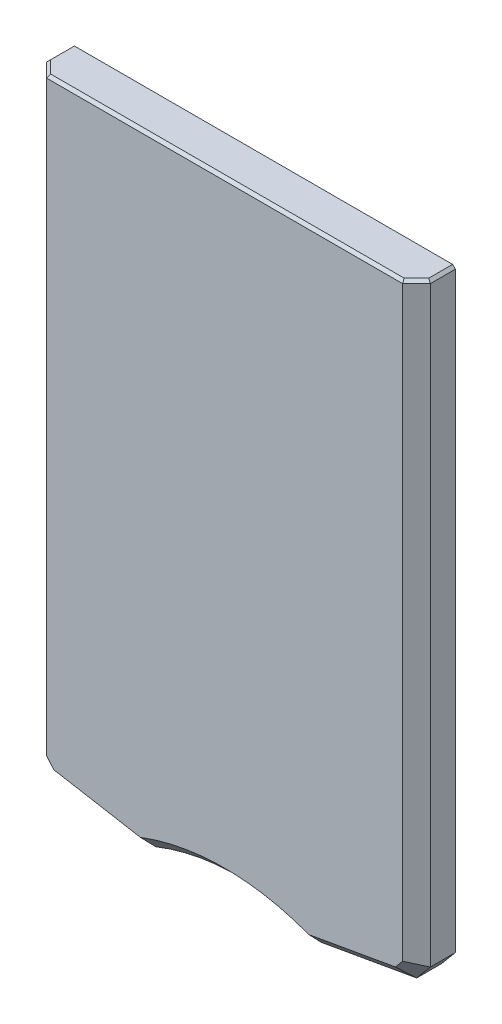
ISO-10303-21;
HEADER;
FILE_DESCRIPTION(('STEP AP214'),'2;1');
FILE_NAME('part.step','',(''),(''),'','','');
FILE_SCHEMA(('AUTOMOTIVE_DESIGN { 1 0 10303 214 1 1 1 1 }'));
ENDSEC;
DATA;
#1=APPLICATION_CONTEXT('core data for automotive mechanical design processes');
#2=APPLICATION_PROTOCOL_DEFINITION('international standard','automotive_design',2000,#1);
#3=PRODUCT_CONTEXT('',#1,'mechanical');
#4=PRODUCT('Part','Part','',(#3));
#5=PRODUCT_RELATED_PRODUCT_CATEGORY('part','',(#4));
#6=PRODUCT_DEFINITION_FORMATION('','',#4);
#7=PRODUCT_DEFINITION_CONTEXT('part definition',#1,'design');
#8=PRODUCT_DEFINITION('design','',#6,#7);
#9=PRODUCT_DEFINITION_SHAPE('','',#8);
#10=(LENGTH_UNIT() NAMED_UNIT(*) SI_UNIT(.MILLI.,.METRE.));
#11=(NAMED_UNIT(*) PLANE_ANGLE_UNIT() SI_UNIT($,.RADIAN.));
#12=(NAMED_UNIT(*) SI_UNIT($,.STERADIAN.) SOLID_ANGLE_UNIT());
#13=UNCERTAINTY_MEASURE_WITH_UNIT(LENGTH_MEASURE(1.E-05),#10,'distance_accuracy_value','');
#14=(GEOMETRIC_REPRESENTATION_CONTEXT(3) GLOBAL_UNCERTAINTY_ASSIGNED_CONTEXT((#13)) GLOBAL_UNIT_ASSIGNED_CONTEXT((#10,
#11,#12)) REPRESENTATION_CONTEXT('',''));
#15=CARTESIAN_POINT('',(0.,0.,0.));
#16=DIRECTION('',(0.,0.,1.));
#17=DIRECTION('',(1.,0.,0.));
#18=AXIS2_PLACEMENT_3D('',#15,#16,#17);
#19=CARTESIAN_POINT('',(0.,0.,7.));
#20=DIRECTION('',(0.,0.,-1.));
#21=DIRECTION('',(-1.,0.,0.));
#22=AXIS2_PLACEMENT_3D('',#19,#20,#21);
#23=CYLINDRICAL_SURFACE('',#22,40.);
#24=DIRECTION('',(0.,0.,-1.));
#25=VECTOR('',#24,1.);
#26=CARTESIAN_POINT('',(14.8896384731941,37.1254449958189,7.));
#27=LINE('',#26,#25);
#28=CARTESIAN_POINT('',(14.8896384731941,37.1254449958189,4.49999999999997));
#29=VERTEX_POINT('',#28);
#30=CARTESIAN_POINT('',(14.8896384731941,37.1254449958189,0.));
#31=VERTEX_POINT('',#30);
#32=EDGE_CURVE('E153',#29,#31,#27,.T.);
#33=ORIENTED_EDGE('',*,*,#32,.F.);
#34=CARTESIAN_POINT('',(0.,0.,4.49999999999997));
#35=DIRECTION('',(0.,0.,1.));
#36=DIRECTION('',(1.,0.,0.));
#37=AXIS2_PLACEMENT_3D('',#34,#35,#36);
#38=CIRCLE('',#37,40.);
#39=CARTESIAN_POINT('',(-14.8896384731941,37.1254449958189,4.49999999999997));
#40=VERTEX_POINT('',#39);
#41=EDGE_CURVE('E224',#29,#40,#38,.T.);
#42=ORIENTED_EDGE('',*,*,#41,.T.);
#43=DIRECTION('',(0.,0.,-1.));
#44=VECTOR('',#43,1.);
#45=CARTESIAN_POINT('',(-14.8896384731941,37.1254449958189,7.));
#46=LINE('',#45,#44);
#47=CARTESIAN_POINT('',(-14.8896384731941,37.1254449958189,0.));
#48=VERTEX_POINT('',#47);
#49=EDGE_CURVE('E170',#40,#48,#46,.T.);
#50=ORIENTED_EDGE('',*,*,#49,.T.);
#51=CARTESIAN_POINT('',(0.,0.,0.));
#52=DIRECTION('',(0.,0.,1.));
#53=DIRECTION('',(1.,0.,0.));
#54=AXIS2_PLACEMENT_3D('',#51,#52,#53);
#55=CIRCLE('',#54,40.);
#56=EDGE_CURVE('E168',#31,#48,#55,.T.);
#57=ORIENTED_EDGE('',*,*,#56,.F.);
#58=EDGE_LOOP('',(#33,#42,#50,#57));
#59=FACE_BOUND('',#58,.T.);
#60=ADVANCED_FACE('F43',(#59),#23,.F.);
#61=CARTESIAN_POINT('',(-5.89984747236775,33.459697708557,7.));
#62=DIRECTION('',(0.173648177666929,-0.984807753012208,0.));
#63=DIRECTION('',(0.984807753012208,0.173648177666929,0.));
#64=AXIS2_PLACEMENT_3D('',#61,#62,#63);
#65=PLANE('',#64);
#66=DIRECTION('',(0.,0.,-1.));
#67=VECTOR('',#66,1.);
#68=CARTESIAN_POINT('',(32.0379806174695,40.1491603902747,7.));
#69=LINE('',#68,#67);
#70=CARTESIAN_POINT('',(32.0379806174695,40.1491603902747,4.49999999999997));
#71=VERTEX_POINT('',#70);
#72=CARTESIAN_POINT('',(32.0379806174695,40.1491603902747,0.));
#73=VERTEX_POINT('',#72);
#74=EDGE_CURVE('E165',#71,#73,#69,.T.);
#75=ORIENTED_EDGE('',*,*,#74,.F.);
#76=DIRECTION('',(-0.984807753012208,-0.173648177666929,0.));
#77=VECTOR('',#76,1.);
#78=CARTESIAN_POINT('',(-5.89984747236775,33.459697708557,4.49999999999997));
#79=LINE('',#78,#77);
#80=EDGE_CURVE('E161',#71,#29,#79,.T.);
#81=ORIENTED_EDGE('',*,*,#80,.T.);
#82=ORIENTED_EDGE('',*,*,#32,.T.);
#83=DIRECTION('',(-0.984807753012208,-0.173648177666929,0.));
#84=VECTOR('',#83,1.);
#85=CARTESIAN_POINT('',(-5.89984747236775,33.459697708557,0.));
#86=LINE('',#85,#84);
#87=EDGE_CURVE('E158',#73,#31,#86,.T.);
#88=ORIENTED_EDGE('',*,*,#87,.F.);
#89=EDGE_LOOP('',(#75,#81,#82,#88));
#90=FACE_BOUND('',#89,.T.);
#91=ADVANCED_FACE('F156',(#90),#65,.T.);
#92=CARTESIAN_POINT('',(-0.968943430725821,0.813040075353683,7.));
#93=DIRECTION('',(0.766044443118978,-0.642787609686539,0.));
#94=DIRECTION('',(0.642787609686539,0.766044443118979,0.));
#95=AXIS2_PLACEMENT_3D('',#92,#93,#94);
#96=PLANE('',#95);
#97=DIRECTION('',(0.,0.,-1.));
#98=VECTOR('',#97,1.);
#99=CARTESIAN_POINT('',(34.5,43.083280834442,7.));
#100=LINE('',#99,#98);
#101=CARTESIAN_POINT('',(34.5,43.083280834442,4.49999999999997));
#102=VERTEX_POINT('',#101);
#103=CARTESIAN_POINT('',(34.5,43.083280834442,0.));
#104=VERTEX_POINT('',#103);
#105=EDGE_CURVE('E202',#102,#104,#100,.T.);
#106=ORIENTED_EDGE('',*,*,#105,.F.);
#107=DIRECTION('',(-0.642787609686539,-0.766044443118979,0.));
#108=VECTOR('',#107,1.);
#109=CARTESIAN_POINT('',(-0.968943430725821,0.813040075353683,4.49999999999997));
#110=LINE('',#109,#108);
#111=EDGE_CURVE('E227',#102,#71,#110,.T.);
#112=ORIENTED_EDGE('',*,*,#111,.T.);
#113=ORIENTED_EDGE('',*,*,#74,.T.);
#114=DIRECTION('',(-0.642787609686539,-0.766044443118979,0.));
#115=VECTOR('',#114,1.);
#116=CARTESIAN_POINT('',(-0.968943430725821,0.813040075353683,0.));
#117=LINE('',#116,#115);
#118=EDGE_CURVE('E180',#104,#73,#117,.T.);
#119=ORIENTED_EDGE('',*,*,#118,.F.);
#120=EDGE_LOOP('',(#106,#112,#113,#119));
#121=FACE_BOUND('',#120,.T.);
#122=ADVANCED_FACE('F325',(#121),#96,.T.);
#123=CARTESIAN_POINT('',(34.5,0.,7.));
#124=DIRECTION('',(-1.,0.,0.));
#125=DIRECTION('',(0.,-1.,0.));
#126=AXIS2_PLACEMENT_3D('',#123,#124,#125);
#127=PLANE('',#126);
#128=DIRECTION('',(0.,1.,0.));
#129=VECTOR('',#128,1.);
#130=CARTESIAN_POINT('',(34.5,0.,0.));
#131=LINE('',#130,#129);
#132=CARTESIAN_POINT('',(34.5,149.5,0.));
#133=VERTEX_POINT('',#132);
#134=EDGE_CURVE('E182',#104,#133,#131,.T.);
#135=ORIENTED_EDGE('',*,*,#134,.T.);
#136=DIRECTION('',(0.,0.,1.));
#137=VECTOR('',#136,1.);
#138=CARTESIAN_POINT('',(34.5,149.5,4.49999999999997));
#139=LINE('',#138,#137);
#140=CARTESIAN_POINT('',(34.5,149.5,4.49999999999997));
#141=VERTEX_POINT('',#140);
#142=EDGE_CURVE('E374',#133,#141,#139,.T.);
#143=ORIENTED_EDGE('',*,*,#142,.T.);
#144=DIRECTION('',(0.,-1.,0.));
#145=VECTOR('',#144,1.);
#146=CARTESIAN_POINT('',(34.5,43.083280834442,4.49999999999997));
#147=LINE('',#146,#145);
#148=EDGE_CURVE('E229',#141,#102,#147,.T.);
#149=ORIENTED_EDGE('',*,*,#148,.T.);
#150=ORIENTED_EDGE('',*,*,#105,.T.);
#151=EDGE_LOOP('',(#135,#143,#149,#150));
#152=FACE_BOUND('',#151,.T.);
#153=ADVANCED_FACE('F420',(#152),#127,.F.);
#154=CARTESIAN_POINT('',(0.,150.,7.));
#155=DIRECTION('',(0.,1.,0.));
#156=DIRECTION('',(0.,0.,1.));
#157=AXIS2_PLACEMENT_3D('',#154,#155,#156);
#158=PLANE('',#157);
#159=DIRECTION('',(0.70710678118655,0.,-0.707106781186546));
#160=VECTOR('',#159,1.);
#161=CARTESIAN_POINT('',(15.6464466094066,150.,22.6464466094067));
#162=LINE('',#161,#160);
#163=CARTESIAN_POINT('',(31.7928932188134,150.,6.50000000000001));
#164=VERTEX_POINT('',#163);
#165=CARTESIAN_POINT('',(34.,150.,4.29289321881343));
#166=VERTEX_POINT('',#165);
#167=EDGE_CURVE('E365',#164,#166,#162,.T.);
#168=ORIENTED_EDGE('',*,*,#167,.T.);
#169=DIRECTION('',(0.,0.,-1.));
#170=VECTOR('',#169,1.);
#171=CARTESIAN_POINT('',(34.,150.,0.));
#172=LINE('',#171,#170);
#173=CARTESIAN_POINT('',(34.,150.,0.));
#174=VERTEX_POINT('',#173);
#175=EDGE_CURVE('E367',#166,#174,#172,.T.);
#176=ORIENTED_EDGE('',*,*,#175,.T.);
#177=DIRECTION('',(1.,0.,0.));
#178=VECTOR('',#177,1.);
#179=CARTESIAN_POINT('',(0.,150.,0.));
#180=LINE('',#179,#178);
#181=CARTESIAN_POINT('',(-34.,150.,0.));
#182=VERTEX_POINT('',#181);
#183=EDGE_CURVE('E187',#182,#174,#180,.T.);
#184=ORIENTED_EDGE('',*,*,#183,.F.);
#185=DIRECTION('',(0.,0.,1.));
#186=VECTOR('',#185,1.);
#187=CARTESIAN_POINT('',(-34.,150.,7.));
#188=LINE('',#187,#186);
#189=CARTESIAN_POINT('',(-34.,150.,4.29289321881342));
#190=VERTEX_POINT('',#189);
#191=EDGE_CURVE('E231',#182,#190,#188,.T.);
#192=ORIENTED_EDGE('',*,*,#191,.T.);
#193=DIRECTION('',(0.70710678118655,0.,0.707106781186546));
#194=VECTOR('',#193,1.);
#195=CARTESIAN_POINT('',(-15.6464466094066,150.,22.6464466094067));
#196=LINE('',#195,#194);
#197=CARTESIAN_POINT('',(-31.7928932188134,150.,6.50000000000001));
#198=VERTEX_POINT('',#197);
#199=EDGE_CURVE('E361',#190,#198,#196,.T.);
#200=ORIENTED_EDGE('',*,*,#199,.T.);
#201=DIRECTION('',(1.,0.,0.));
#202=VECTOR('',#201,1.);
#203=CARTESIAN_POINT('',(0.,150.,6.50000000000001));
#204=LINE('',#203,#202);
#205=EDGE_CURVE('E363',#198,#164,#204,.T.);
#206=ORIENTED_EDGE('',*,*,#205,.T.);
#207=EDGE_LOOP('',(#168,#176,#184,#192,#200,#206));
#208=FACE_BOUND('',#207,.T.);
#209=ADVANCED_FACE('F417',(#208),#158,.T.);
#210=CARTESIAN_POINT('',(-34.5,0.,7.));
#211=DIRECTION('',(-1.,0.,0.));
#212=DIRECTION('',(0.,-1.,0.));
#213=AXIS2_PLACEMENT_3D('',#210,#211,#212);
#214=PLANE('',#213);
#215=DIRECTION('',(0.,1.,0.));
#216=VECTOR('',#215,1.);
#217=CARTESIAN_POINT('',(-34.5,0.,4.49999999999997));
#218=LINE('',#217,#216);
#219=CARTESIAN_POINT('',(-34.5,43.083280834442,4.49999999999997));
#220=VERTEX_POINT('',#219);
#221=CARTESIAN_POINT('',(-34.5,149.5,4.49999999999997));
#222=VERTEX_POINT('',#221);
#223=EDGE_CURVE('E164',#220,#222,#218,.T.);
#224=ORIENTED_EDGE('',*,*,#223,.T.);
#225=DIRECTION('',(0.,0.,-1.));
#226=VECTOR('',#225,1.);
#227=CARTESIAN_POINT('',(-34.5,149.5,7.));
#228=LINE('',#227,#226);
#229=CARTESIAN_POINT('',(-34.5,149.5,0.));
#230=VERTEX_POINT('',#229);
#231=EDGE_CURVE('E11',#222,#230,#228,.T.);
#232=ORIENTED_EDGE('',*,*,#231,.T.);
#233=DIRECTION('',(0.,1.,0.));
#234=VECTOR('',#233,1.);
#235=CARTESIAN_POINT('',(-34.5,0.,0.));
#236=LINE('',#235,#234);
#237=CARTESIAN_POINT('',(-34.5,43.083280834442,0.));
#238=VERTEX_POINT('',#237);
#239=EDGE_CURVE('E189',#238,#230,#236,.T.);
#240=ORIENTED_EDGE('',*,*,#239,.F.);
#241=DIRECTION('',(0.,0.,-1.));
#242=VECTOR('',#241,1.);
#243=CARTESIAN_POINT('',(-34.5,43.083280834442,7.));
#244=LINE('',#243,#242);
#245=EDGE_CURVE('E200',#220,#238,#244,.T.);
#246=ORIENTED_EDGE('',*,*,#245,.F.);
#247=EDGE_LOOP('',(#224,#232,#240,#246));
#248=FACE_BOUND('',#247,.T.);
#249=ADVANCED_FACE('F396',(#248),#214,.T.);
#250=CARTESIAN_POINT('',(0.968943430725821,0.813040075353683,7.));
#251=DIRECTION('',(0.766044443118978,0.642787609686539,0.));
#252=DIRECTION('',(-0.642787609686539,0.766044443118979,0.));
#253=AXIS2_PLACEMENT_3D('',#250,#251,#252);
#254=PLANE('',#253);
#255=DIRECTION('',(0.,0.,-1.));
#256=VECTOR('',#255,1.);
#257=CARTESIAN_POINT('',(-32.0379806174695,40.1491603902747,7.));
#258=LINE('',#257,#256);
#259=CARTESIAN_POINT('',(-32.0379806174695,40.1491603902747,4.49999999999997));
#260=VERTEX_POINT('',#259);
#261=CARTESIAN_POINT('',(-32.0379806174695,40.1491603902747,0.));
#262=VERTEX_POINT('',#261);
#263=EDGE_CURVE('E198',#260,#262,#258,.T.);
#264=ORIENTED_EDGE('',*,*,#263,.F.);
#265=DIRECTION('',(-0.642787609686539,0.766044443118979,0.));
#266=VECTOR('',#265,1.);
#267=CARTESIAN_POINT('',(-34.5,43.083280834442,4.49999999999997));
#268=LINE('',#267,#266);
#269=EDGE_CURVE('E220',#260,#220,#268,.T.);
#270=ORIENTED_EDGE('',*,*,#269,.T.);
#271=ORIENTED_EDGE('',*,*,#245,.T.);
#272=DIRECTION('',(0.642787609686539,-0.766044443118979,0.));
#273=VECTOR('',#272,1.);
#274=CARTESIAN_POINT('',(0.968943430725821,0.813040075353683,0.));
#275=LINE('',#274,#273);
#276=EDGE_CURVE('E192',#238,#262,#275,.T.);
#277=ORIENTED_EDGE('',*,*,#276,.T.);
#278=EDGE_LOOP('',(#264,#270,#271,#277));
#279=FACE_BOUND('',#278,.T.);
#280=ADVANCED_FACE('F402',(#279),#254,.F.);
#281=CARTESIAN_POINT('',(5.89984747236775,33.459697708557,7.));
#282=DIRECTION('',(0.173648177666929,0.984807753012208,0.));
#283=DIRECTION('',(-0.984807753012208,0.173648177666929,0.));
#284=AXIS2_PLACEMENT_3D('',#281,#282,#283);
#285=PLANE('',#284);
#286=ORIENTED_EDGE('',*,*,#49,.F.);
#287=DIRECTION('',(-0.984807753012208,0.173648177666929,0.));
#288=VECTOR('',#287,1.);
#289=CARTESIAN_POINT('',(-32.0379806174695,40.1491603902747,4.49999999999997));
#290=LINE('',#289,#288);
#291=EDGE_CURVE('E222',#40,#260,#290,.T.);
#292=ORIENTED_EDGE('',*,*,#291,.T.);
#293=ORIENTED_EDGE('',*,*,#263,.T.);
#294=DIRECTION('',(0.984807753012208,-0.173648177666929,0.));
#295=VECTOR('',#294,1.);
#296=CARTESIAN_POINT('',(5.89984747236775,33.459697708557,0.));
#297=LINE('',#296,#295);
#298=EDGE_CURVE('E195',#262,#48,#297,.T.);
#299=ORIENTED_EDGE('',*,*,#298,.T.);
#300=EDGE_LOOP('',(#286,#292,#293,#299));
#301=FACE_BOUND('',#300,.T.);
#302=ADVANCED_FACE('F404',(#301),#285,.F.);
#303=CARTESIAN_POINT('',(0.,0.,7.));
#304=DIRECTION('',(0.,0.,1.));
#305=DIRECTION('',(1.,0.,0.));
#306=AXIS2_PLACEMENT_3D('',#303,#304,#305);
#307=PLANE('',#306);
#308=DIRECTION('',(0.,1.,0.));
#309=VECTOR('',#308,1.);
#310=CARTESIAN_POINT('',(32.,150.,7.));
#311=LINE('',#310,#309);
#312=CARTESIAN_POINT('',(32.,43.9932064201076,7.));
#313=VERTEX_POINT('',#312);
#314=CARTESIAN_POINT('',(32.,149.5,7.));
#315=VERTEX_POINT('',#314);
#316=EDGE_CURVE('E206',#313,#315,#311,.T.);
#317=ORIENTED_EDGE('',*,*,#316,.T.);
#318=DIRECTION('',(-1.,0.,0.));
#319=VECTOR('',#318,1.);
#320=CARTESIAN_POINT('',(0.,149.5,7.));
#321=LINE('',#320,#319);
#322=CARTESIAN_POINT('',(-32.,149.5,7.));
#323=VERTEX_POINT('',#322);
#324=EDGE_CURVE('E68',#315,#323,#321,.T.);
#325=ORIENTED_EDGE('',*,*,#324,.T.);
#326=DIRECTION('',(0.,-1.,0.));
#327=VECTOR('',#326,1.);
#328=CARTESIAN_POINT('',(-32.,0.,7.));
#329=LINE('',#328,#327);
#330=CARTESIAN_POINT('',(-32.,43.9932064201076,7.));
#331=VERTEX_POINT('',#330);
#332=EDGE_CURVE('E218',#323,#331,#329,.T.);
#333=ORIENTED_EDGE('',*,*,#332,.T.);
#334=DIRECTION('',(0.642787609686539,-0.766044443118979,0.));
#335=VECTOR('',#334,1.);
#336=CARTESIAN_POINT('',(-30.122869509672,41.7561294144911,7.));
#337=LINE('',#336,#335);
#338=CARTESIAN_POINT('',(-30.7077584018746,42.453172853042,7.));
#339=VERTEX_POINT('',#338);
#340=EDGE_CURVE('E216',#331,#339,#337,.T.);
#341=ORIENTED_EDGE('',*,*,#340,.T.);
#342=DIRECTION('',(0.984807753012208,-0.173648177666929,0.));
#343=VECTOR('',#342,1.);
#344=CARTESIAN_POINT('',(-14.4555180290268,39.5874643783495,7.));
#345=LINE('',#344,#343);
#346=CARTESIAN_POINT('',(-15.1466079457446,39.7093221767624,7.));
#347=VERTEX_POINT('',#346);
#348=EDGE_CURVE('E214',#339,#347,#345,.T.);
#349=ORIENTED_EDGE('',*,*,#348,.T.);
#350=CARTESIAN_POINT('',(0.,0.,7.));
#351=DIRECTION('',(0.,0.,1.));
#352=DIRECTION('',(1.,0.,0.));
#353=AXIS2_PLACEMENT_3D('',#350,#351,#352);
#354=CIRCLE('',#353,42.5000000000001);
#355=CARTESIAN_POINT('',(15.1466079457446,39.7093221767624,7.));
#356=VERTEX_POINT('',#355);
#357=EDGE_CURVE('E212',#347,#356,#354,.F.);
#358=ORIENTED_EDGE('',*,*,#357,.T.);
#359=DIRECTION('',(0.984807753012208,0.173648177666929,0.));
#360=VECTOR('',#359,1.);
#361=CARTESIAN_POINT('',(-6.33396791653509,35.9217170910876,7.));
#362=LINE('',#361,#360);
#363=CARTESIAN_POINT('',(30.7077584018746,42.453172853042,7.));
#364=VERTEX_POINT('',#363);
#365=EDGE_CURVE('E210',#356,#364,#362,.T.);
#366=ORIENTED_EDGE('',*,*,#365,.T.);
#367=DIRECTION('',(0.642787609686539,0.766044443118979,0.));
#368=VECTOR('',#367,1.);
#369=CARTESIAN_POINT('',(-2.8840545385233,2.42000909957006,7.));
#370=LINE('',#369,#368);
#371=EDGE_CURVE('E208',#364,#313,#370,.T.);
#372=ORIENTED_EDGE('',*,*,#371,.T.);
#373=EDGE_LOOP('',(#317,#325,#333,#341,#349,#358,#366,#372));
#374=FACE_BOUND('',#373,.T.);
#375=ADVANCED_FACE('F349',(#374),#307,.T.);
#376=CARTESIAN_POINT('',(0.,0.,0.));
#377=DIRECTION('',(0.,0.,1.));
#378=DIRECTION('',(1.,0.,0.));
#379=AXIS2_PLACEMENT_3D('',#376,#377,#378);
#380=PLANE('',#379);
#381=ORIENTED_EDGE('',*,*,#183,.T.);
#382=DIRECTION('',(0.707106781186557,-0.707106781186538,0.));
#383=VECTOR('',#382,1.);
#384=CARTESIAN_POINT('',(34.,150.,0.));
#385=LINE('',#384,#383);
#386=EDGE_CURVE('E372',#174,#133,#385,.T.);
#387=ORIENTED_EDGE('',*,*,#386,.T.);
#388=ORIENTED_EDGE('',*,*,#134,.F.);
#389=ORIENTED_EDGE('',*,*,#118,.T.);
#390=ORIENTED_EDGE('',*,*,#87,.T.);
#391=ORIENTED_EDGE('',*,*,#56,.T.);
#392=ORIENTED_EDGE('',*,*,#298,.F.);
#393=ORIENTED_EDGE('',*,*,#276,.F.);
#394=ORIENTED_EDGE('',*,*,#239,.T.);
#395=DIRECTION('',(-0.707106781186557,-0.707106781186538,0.));
#396=VECTOR('',#395,1.);
#397=CARTESIAN_POINT('',(-34.5,149.5,0.));
#398=LINE('',#397,#396);
#399=EDGE_CURVE('E370',#230,#182,#398,.F.);
#400=ORIENTED_EDGE('',*,*,#399,.T.);
#401=EDGE_LOOP('',(#381,#387,#388,#389,#390,#391,#392,#393,#394,#400));
#402=FACE_BOUND('',#401,.T.);
#403=ADVANCED_FACE('F177',(#402),#380,.F.);
#404=CARTESIAN_POINT('',(32.,0.,7.));
#405=DIRECTION('',(0.707106781186545,0.,0.707106781186549));
#406=DIRECTION('',(0.,-1.,0.));
#407=AXIS2_PLACEMENT_3D('',#404,#405,#406);
#408=PLANE('',#407);
#409=ORIENTED_EDGE('',*,*,#148,.F.);
#410=DIRECTION('',(-0.70710678118655,0.,0.707106781186546));
#411=VECTOR('',#410,1.);
#412=CARTESIAN_POINT('',(32.,149.5,7.00000000000001));
#413=LINE('',#412,#411);
#414=EDGE_CURVE('E376',#141,#315,#413,.T.);
#415=ORIENTED_EDGE('',*,*,#414,.T.);
#416=ORIENTED_EDGE('',*,*,#316,.F.);
#417=DIRECTION('',(-0.684791078771738,0.249243569363956,0.684791078771734));
#418=VECTOR('',#417,1.);
#419=CARTESIAN_POINT('',(39.5087504739609,41.2602447510535,-0.508750473960933));
#420=LINE('',#419,#418);
#421=EDGE_CURVE('E174',#102,#313,#420,.T.);
#422=ORIENTED_EDGE('',*,*,#421,.F.);
#423=EDGE_LOOP('',(#409,#415,#416,#422));
#424=FACE_BOUND('',#423,.T.);
#425=ADVANCED_FACE('F281',(#424),#408,.T.);
#426=CARTESIAN_POINT('',(-0.968943430725821,0.813040075353683,4.49999999999997));
#427=DIRECTION('',(-0.5416752204197,0.454519477672042,-0.70710678118655));
#428=DIRECTION('',(-0.642787609686539,-0.766044443118979,0.));
#429=AXIS2_PLACEMENT_3D('',#426,#427,#428);
#430=PLANE('',#429);
#431=ORIENTED_EDGE('',*,*,#421,.T.);
#432=ORIENTED_EDGE('',*,*,#371,.F.);
#433=DIRECTION('',(0.364369722409343,-0.631106871952749,-0.684791078771733));
#434=VECTOR('',#433,1.);
#435=CARTESIAN_POINT('',(36.7013927784795,32.0718935907708,-4.2643479907687));
#436=LINE('',#435,#434);
#437=EDGE_CURVE('E354',#71,#364,#436,.F.);
#438=ORIENTED_EDGE('',*,*,#437,.F.);
#439=ORIENTED_EDGE('',*,*,#111,.F.);
#440=EDGE_LOOP('',(#431,#432,#438,#439));
#441=FACE_BOUND('',#440,.T.);
#442=ADVANCED_FACE('F274',(#441),#430,.F.);
#443=CARTESIAN_POINT('',(-5.89984747236775,33.459697708557,4.49999999999997));
#444=DIRECTION('',(-0.122787803968972,0.696364240320017,-0.70710678118655));
#445=DIRECTION('',(-0.984807753012208,-0.173648177666929,0.));
#446=AXIS2_PLACEMENT_3D('',#443,#444,#445);
#447=PLANE('',#446);
#448=ORIENTED_EDGE('',*,*,#437,.T.);
#449=ORIENTED_EDGE('',*,*,#365,.F.);
#450=CARTESIAN_POINT('',(15.1466079457446,39.7093221767624,7.));
#451=CARTESIAN_POINT('',(15.105636198429,39.2787411894298,6.58307517463241));
#452=CARTESIAN_POINT('',(15.0637362037086,38.8481276132544,6.16627944399002));
#453=CARTESIAN_POINT('',(14.9780797131327,37.9868352196163,5.33294611061854));
#454=CARTESIAN_POINT('',(14.934323217003,37.5561564021438,4.91640850792758));
#455=CARTESIAN_POINT('',(14.8896384731942,37.125444995819,4.49999999999996));
#456=B_SPLINE_CURVE_WITH_KNOTS('',3,(#450,#451,#452,#453,#454,#455),.UNSPECIFIED.,.F.,.F.,(4,2,
4),(0.,1.8022544447532,3.60450915567967),.UNSPECIFIED.);
#457=EDGE_CURVE('E247',#29,#356,#456,.F.);
#458=ORIENTED_EDGE('',*,*,#457,.F.);
#459=ORIENTED_EDGE('',*,*,#80,.F.);
#460=EDGE_LOOP('',(#448,#449,#458,#459));
#461=FACE_BOUND('',#460,.T.);
#462=ADVANCED_FACE('F267',(#461),#447,.F.);
#463=CARTESIAN_POINT('',(0.,0.,4.49999999999997));
#464=DIRECTION('',(0.,0.,1.));
#465=DIRECTION('',(1.,0.,0.));
#466=AXIS2_PLACEMENT_3D('',#463,#464,#465);
#467=CONICAL_SURFACE('',#466,40.,0.785398163397451);
#468=ORIENTED_EDGE('',*,*,#457,.T.);
#469=ORIENTED_EDGE('',*,*,#357,.F.);
#470=CARTESIAN_POINT('',(-15.1466079457446,39.7093221767624,7.));
#471=CARTESIAN_POINT('',(-15.105636198429,39.2787411894299,6.58307517463242));
#472=CARTESIAN_POINT('',(-15.0637362037086,38.8481276132545,6.16627944399003));
#473=CARTESIAN_POINT('',(-14.9780797131327,37.9868352196163,5.33294611061855));
#474=CARTESIAN_POINT('',(-14.934323217003,37.5561564021438,4.91640850792759));
#475=CARTESIAN_POINT('',(-14.8896384731942,37.125444995819,4.49999999999996));
#476=B_SPLINE_CURVE_WITH_KNOTS('',3,(#470,#471,#472,#473,#474,#475),.UNSPECIFIED.,.F.,.F.,(4,2,
4),(0.,1.80225444475321,3.60450915567971),.UNSPECIFIED.);
#477=EDGE_CURVE('E238',#40,#347,#476,.F.);
#478=ORIENTED_EDGE('',*,*,#477,.F.);
#479=ORIENTED_EDGE('',*,*,#41,.F.);
#480=EDGE_LOOP('',(#468,#469,#478,#479));
#481=FACE_BOUND('',#480,.T.);
#482=ADVANCED_FACE('F255',(#481),#467,.F.);
#483=CARTESIAN_POINT('',(6.33396791653508,35.9217170910875,7.));
#484=DIRECTION('',(-0.122787803968972,-0.696364240320017,0.70710678118655));
#485=DIRECTION('',(-0.984807753012208,0.173648177666929,0.));
#486=AXIS2_PLACEMENT_3D('',#483,#484,#485);
#487=PLANE('',#486);
#488=ORIENTED_EDGE('',*,*,#477,.T.);
#489=ORIENTED_EDGE('',*,*,#348,.F.);
#490=DIRECTION('',(-0.364369722409343,-0.631106871952749,-0.684791078771733));
#491=VECTOR('',#490,1.);
#492=CARTESIAN_POINT('',(-27.2918516753453,48.3696968573069,13.4198046884249));
#493=LINE('',#492,#491);
#494=EDGE_CURVE('E235',#260,#339,#493,.F.);
#495=ORIENTED_EDGE('',*,*,#494,.F.);
#496=ORIENTED_EDGE('',*,*,#291,.F.);
#497=EDGE_LOOP('',(#488,#489,#495,#496));
#498=FACE_BOUND('',#497,.T.);
#499=ADVANCED_FACE('F259',(#498),#487,.T.);
#500=CARTESIAN_POINT('',(2.8840545385233,2.42000909957006,7.));
#501=DIRECTION('',(-0.5416752204197,-0.454519477672042,0.70710678118655));
#502=DIRECTION('',(-0.642787609686539,0.766044443118979,0.));
#503=AXIS2_PLACEMENT_3D('',#500,#501,#502);
#504=PLANE('',#503);
#505=ORIENTED_EDGE('',*,*,#494,.T.);
#506=ORIENTED_EDGE('',*,*,#340,.F.);
#507=DIRECTION('',(0.684791078771738,0.249243569363956,0.684791078771734));
#508=VECTOR('',#507,1.);
#509=CARTESIAN_POINT('',(-22.7372164440967,47.3645839209068,16.2627835559032));
#510=LINE('',#509,#508);
#511=EDGE_CURVE('E232',#220,#331,#510,.T.);
#512=ORIENTED_EDGE('',*,*,#511,.F.);
#513=ORIENTED_EDGE('',*,*,#269,.F.);
#514=EDGE_LOOP('',(#505,#506,#512,#513));
#515=FACE_BOUND('',#514,.T.);
#516=ADVANCED_FACE('F265',(#515),#504,.T.);
#517=CARTESIAN_POINT('',(-34.5,0.,4.49999999999997));
#518=DIRECTION('',(0.707106781186545,0.,-0.707106781186549));
#519=DIRECTION('',(0.,1.,0.));
#520=AXIS2_PLACEMENT_3D('',#517,#518,#519);
#521=PLANE('',#520);
#522=ORIENTED_EDGE('',*,*,#332,.F.);
#523=DIRECTION('',(0.70710678118655,0.,0.707106781186546));
#524=VECTOR('',#523,1.);
#525=CARTESIAN_POINT('',(-34.5,149.5,4.49999999999997));
#526=LINE('',#525,#524);
#527=EDGE_CURVE('E53',#323,#222,#526,.F.);
#528=ORIENTED_EDGE('',*,*,#527,.T.);
#529=ORIENTED_EDGE('',*,*,#223,.F.);
#530=ORIENTED_EDGE('',*,*,#511,.T.);
#531=EDGE_LOOP('',(#522,#528,#529,#530));
#532=FACE_BOUND('',#531,.T.);
#533=ADVANCED_FACE('F317',(#532),#521,.F.);
#534=CARTESIAN_POINT('',(-34.5,149.5,7.));
#535=DIRECTION('',(0.707106781186538,-0.707106781186557,0.));
#536=DIRECTION('',(0.,0.,-1.));
#537=AXIS2_PLACEMENT_3D('',#534,#535,#536);
#538=PLANE('',#537);
#539=ORIENTED_EDGE('',*,*,#399,.F.);
#540=ORIENTED_EDGE('',*,*,#231,.F.);
#541=DIRECTION('',(-0.678598344545855,-0.678598344545836,0.281084637714828));
#542=VECTOR('',#541,1.);
#543=CARTESIAN_POINT('',(-34.9768589245764,149.023141075424,4.69752143389816));
#544=LINE('',#543,#542);
#545=EDGE_CURVE('E48',#190,#222,#544,.T.);
#546=ORIENTED_EDGE('',*,*,#545,.F.);
#547=ORIENTED_EDGE('',*,*,#191,.F.);
#548=EDGE_LOOP('',(#539,#540,#546,#547));
#549=FACE_BOUND('',#548,.T.);
#550=ADVANCED_FACE('F46',(#549),#538,.F.);
#551=CARTESIAN_POINT('',(-15.6464466094066,150.,22.6464466094067));
#552=DIRECTION('',(-0.499999999999991,0.707106781186559,0.499999999999994));
#553=DIRECTION('',(-0.70710678118655,0.,-0.707106781186546));
#554=AXIS2_PLACEMENT_3D('',#551,#552,#553);
#555=PLANE('',#554);
#556=ORIENTED_EDGE('',*,*,#545,.T.);
#557=ORIENTED_EDGE('',*,*,#527,.F.);
#558=DIRECTION('',(-0.281084637714826,-0.678598344545836,0.678598344545855));
#559=VECTOR('',#558,1.);
#560=CARTESIAN_POINT('',(-33.5970163705098,145.644461418983,10.8555385810168));
#561=LINE('',#560,#559);
#562=EDGE_CURVE('E385',#198,#323,#561,.T.);
#563=ORIENTED_EDGE('',*,*,#562,.F.);
#564=ORIENTED_EDGE('',*,*,#199,.F.);
#565=EDGE_LOOP('',(#556,#557,#563,#564));
#566=FACE_BOUND('',#565,.T.);
#567=ADVANCED_FACE('F308',(#566),#555,.T.);
#568=CARTESIAN_POINT('',(0.,150.,6.50000000000001));
#569=DIRECTION('',(0.,-0.707106781186557,-0.707106781186538));
#570=DIRECTION('',(1.,0.,0.));
#571=AXIS2_PLACEMENT_3D('',#568,#569,#570);
#572=PLANE('',#571);
#573=ORIENTED_EDGE('',*,*,#562,.T.);
#574=ORIENTED_EDGE('',*,*,#324,.F.);
#575=DIRECTION('',(-0.281084637714826,0.678598344545836,-0.678598344545855));
#576=VECTOR('',#575,1.);
#577=CARTESIAN_POINT('',(29.2809820762726,156.064289947798,0.435710052201984));
#578=LINE('',#577,#576);
#579=EDGE_CURVE('E383',#164,#315,#578,.F.);
#580=ORIENTED_EDGE('',*,*,#579,.F.);
#581=ORIENTED_EDGE('',*,*,#205,.F.);
#582=EDGE_LOOP('',(#573,#574,#580,#581));
#583=FACE_BOUND('',#582,.T.);
#584=ADVANCED_FACE('F302',(#583),#572,.F.);
#585=CARTESIAN_POINT('',(15.6464466094066,150.,22.6464466094067));
#586=DIRECTION('',(-0.499999999999991,-0.707106781186559,-0.499999999999994));
#587=DIRECTION('',(0.70710678118655,0.,-0.707106781186546));
#588=AXIS2_PLACEMENT_3D('',#585,#586,#587);
#589=PLANE('',#588);
#590=ORIENTED_EDGE('',*,*,#579,.T.);
#591=ORIENTED_EDGE('',*,*,#414,.F.);
#592=DIRECTION('',(0.678598344545855,-0.678598344545836,0.281084637714828));
#593=VECTOR('',#592,1.);
#594=CARTESIAN_POINT('',(29.0490896340679,154.950910365932,2.24215899915078));
#595=LINE('',#594,#593);
#596=EDGE_CURVE('E380',#166,#141,#595,.T.);
#597=ORIENTED_EDGE('',*,*,#596,.F.);
#598=ORIENTED_EDGE('',*,*,#167,.F.);
#599=EDGE_LOOP('',(#590,#591,#597,#598));
#600=FACE_BOUND('',#599,.T.);
#601=ADVANCED_FACE('F295',(#600),#589,.F.);
#602=CARTESIAN_POINT('',(34.,150.,7.));
#603=DIRECTION('',(0.707106781186538,0.707106781186557,0.));
#604=DIRECTION('',(0.,0.,1.));
#605=AXIS2_PLACEMENT_3D('',#602,#603,#604);
#606=PLANE('',#605);
#607=ORIENTED_EDGE('',*,*,#596,.T.);
#608=ORIENTED_EDGE('',*,*,#142,.F.);
#609=ORIENTED_EDGE('',*,*,#386,.F.);
#610=ORIENTED_EDGE('',*,*,#175,.F.);
#611=EDGE_LOOP('',(#607,#608,#609,#610));
#612=FACE_BOUND('',#611,.T.);
#613=ADVANCED_FACE('F289',(#612),#606,.T.);
#614=CLOSED_SHELL('',(#60,#91,#122,#153,#209,#249,#280,#302,#375,#403,#425,#442,#462,#482,#499,
#516,#533,#550,#567,#584,#601,#613));
#615=MANIFOLD_SOLID_BREP('B2',#614);
#616=ADVANCED_BREP_SHAPE_REPRESENTATION('',(#18,#615),#14);
#617=SHAPE_DEFINITION_REPRESENTATION(#9,#616);
ENDSEC;
END-ISO-10303-21;
